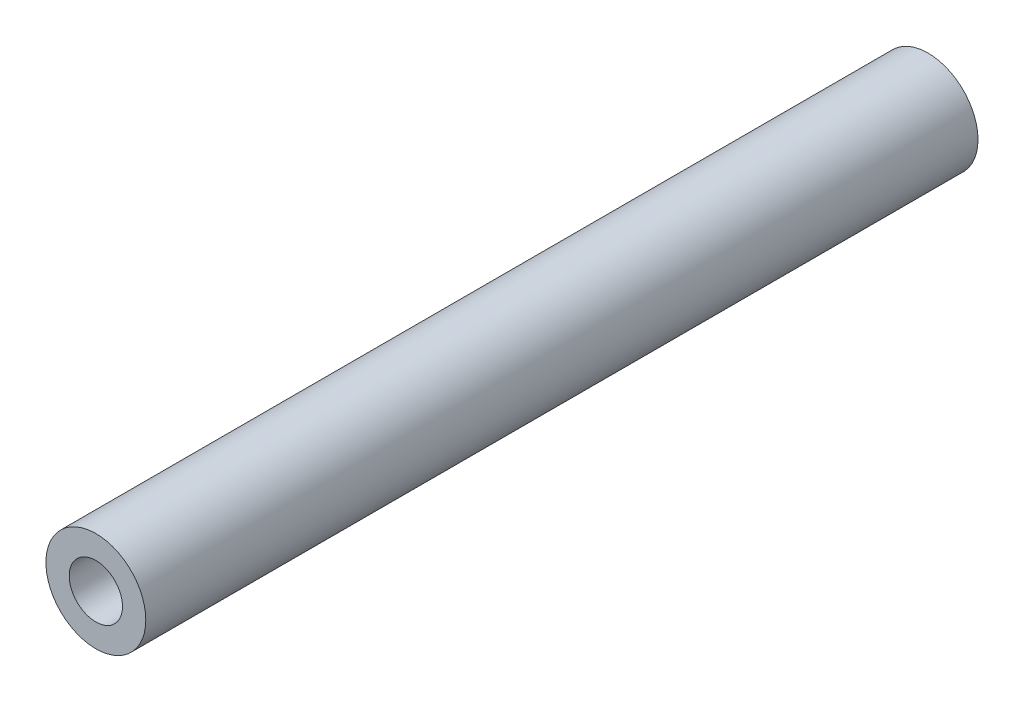
ISO-10303-21;
HEADER;
FILE_DESCRIPTION(('STEP AP214'),'2;1');
FILE_NAME('part.step','',(''),(''),'','','');
FILE_SCHEMA(('AUTOMOTIVE_DESIGN { 1 0 10303 214 1 1 1 1 }'));
ENDSEC;
DATA;
#1=APPLICATION_CONTEXT('core data for automotive mechanical design processes');
#2=APPLICATION_PROTOCOL_DEFINITION('international standard','automotive_design',2000,#1);
#3=PRODUCT_CONTEXT('',#1,'mechanical');
#4=PRODUCT('Part','Part','',(#3));
#5=PRODUCT_RELATED_PRODUCT_CATEGORY('part','',(#4));
#6=PRODUCT_DEFINITION_FORMATION('','',#4);
#7=PRODUCT_DEFINITION_CONTEXT('part definition',#1,'design');
#8=PRODUCT_DEFINITION('design','',#6,#7);
#9=PRODUCT_DEFINITION_SHAPE('','',#8);
#10=(LENGTH_UNIT() NAMED_UNIT(*) SI_UNIT(.MILLI.,.METRE.));
#11=(NAMED_UNIT(*) PLANE_ANGLE_UNIT() SI_UNIT($,.RADIAN.));
#12=(NAMED_UNIT(*) SI_UNIT($,.STERADIAN.) SOLID_ANGLE_UNIT());
#13=UNCERTAINTY_MEASURE_WITH_UNIT(LENGTH_MEASURE(1.E-05),#10,'distance_accuracy_value','');
#14=(GEOMETRIC_REPRESENTATION_CONTEXT(3) GLOBAL_UNCERTAINTY_ASSIGNED_CONTEXT((#13)) GLOBAL_UNIT_ASSIGNED_CONTEXT((#10,
#11,#12)) REPRESENTATION_CONTEXT('',''));
#15=CARTESIAN_POINT('',(0.,0.,0.));
#16=DIRECTION('',(0.,0.,1.));
#17=DIRECTION('',(1.,0.,0.));
#18=AXIS2_PLACEMENT_3D('',#15,#16,#17);
#19=CARTESIAN_POINT('',(0.,0.,50.));
#20=DIRECTION('',(0.,0.,1.));
#21=DIRECTION('',(1.,0.,0.));
#22=AXIS2_PLACEMENT_3D('',#19,#20,#21);
#23=PLANE('',#22);
#24=CARTESIAN_POINT('',(0.,0.,50.));
#25=DIRECTION('',(0.,0.,1.));
#26=DIRECTION('',(1.,0.,0.));
#27=AXIS2_PLACEMENT_3D('',#24,#25,#26);
#28=CIRCLE('',#27,3.);
#29=CARTESIAN_POINT('',(3.,0.,50.));
#30=VERTEX_POINT('',#29);
#31=EDGE_CURVE('E10',#30,#30,#28,.T.);
#32=ORIENTED_EDGE('',*,*,#31,.T.);
#33=EDGE_LOOP('',(#32));
#34=FACE_BOUND('',#33,.T.);
#35=CARTESIAN_POINT('',(0.,0.,50.));
#36=DIRECTION('',(0.,0.,1.));
#37=DIRECTION('',(1.,0.,0.));
#38=AXIS2_PLACEMENT_3D('',#35,#36,#37);
#39=CIRCLE('',#38,1.6);
#40=CARTESIAN_POINT('',(1.6,0.,50.));
#41=VERTEX_POINT('',#40);
#42=EDGE_CURVE('E48',#41,#41,#39,.T.);
#43=ORIENTED_EDGE('',*,*,#42,.F.);
#44=EDGE_LOOP('',(#43));
#45=FACE_BOUND('',#44,.T.);
#46=ADVANCED_FACE('F37',(#34,#45),#23,.T.);
#47=CARTESIAN_POINT('',(0.,0.,0.));
#48=DIRECTION('',(0.,0.,1.));
#49=DIRECTION('',(1.,0.,0.));
#50=AXIS2_PLACEMENT_3D('',#47,#48,#49);
#51=PLANE('',#50);
#52=CARTESIAN_POINT('',(0.,0.,0.));
#53=DIRECTION('',(0.,0.,1.));
#54=DIRECTION('',(1.,0.,0.));
#55=AXIS2_PLACEMENT_3D('',#52,#53,#54);
#56=CIRCLE('',#55,3.);
#57=CARTESIAN_POINT('',(3.,0.,0.));
#58=VERTEX_POINT('',#57);
#59=EDGE_CURVE('E41',#58,#58,#56,.T.);
#60=ORIENTED_EDGE('',*,*,#59,.F.);
#61=EDGE_LOOP('',(#60));
#62=FACE_BOUND('',#61,.T.);
#63=CARTESIAN_POINT('',(0.,0.,0.));
#64=DIRECTION('',(0.,0.,1.));
#65=DIRECTION('',(1.,0.,0.));
#66=AXIS2_PLACEMENT_3D('',#63,#64,#65);
#67=CIRCLE('',#66,1.6);
#68=CARTESIAN_POINT('',(1.6,0.,0.));
#69=VERTEX_POINT('',#68);
#70=EDGE_CURVE('E50',#69,#69,#67,.T.);
#71=ORIENTED_EDGE('',*,*,#70,.T.);
#72=EDGE_LOOP('',(#71));
#73=FACE_BOUND('',#72,.T.);
#74=ADVANCED_FACE('F60',(#62,#73),#51,.F.);
#75=CARTESIAN_POINT('',(0.,0.,50.));
#76=DIRECTION('',(0.,0.,-1.));
#77=DIRECTION('',(-1.,0.,0.));
#78=AXIS2_PLACEMENT_3D('',#75,#76,#77);
#79=CYLINDRICAL_SURFACE('',#78,3.);
#80=ORIENTED_EDGE('',*,*,#31,.F.);
#81=EDGE_LOOP('',(#80));
#82=FACE_BOUND('',#81,.T.);
#83=ORIENTED_EDGE('',*,*,#59,.T.);
#84=EDGE_LOOP('',(#83));
#85=FACE_BOUND('',#84,.T.);
#86=ADVANCED_FACE('F39',(#82,#85),#79,.T.);
#87=CARTESIAN_POINT('',(0.,0.,50.));
#88=DIRECTION('',(0.,0.,-1.));
#89=DIRECTION('',(-1.,0.,0.));
#90=AXIS2_PLACEMENT_3D('',#87,#88,#89);
#91=CYLINDRICAL_SURFACE('',#90,1.6);
#92=ORIENTED_EDGE('',*,*,#42,.T.);
#93=EDGE_LOOP('',(#92));
#94=FACE_BOUND('',#93,.T.);
#95=ORIENTED_EDGE('',*,*,#70,.F.);
#96=EDGE_LOOP('',(#95));
#97=FACE_BOUND('',#96,.T.);
#98=ADVANCED_FACE('F56',(#94,#97),#91,.F.);
#99=CLOSED_SHELL('',(#46,#74,#86,#98));
#100=MANIFOLD_SOLID_BREP('B2',#99);
#101=ADVANCED_BREP_SHAPE_REPRESENTATION('',(#18,#100),#14);
#102=SHAPE_DEFINITION_REPRESENTATION(#9,#101);
ENDSEC;
END-ISO-10303-21;
